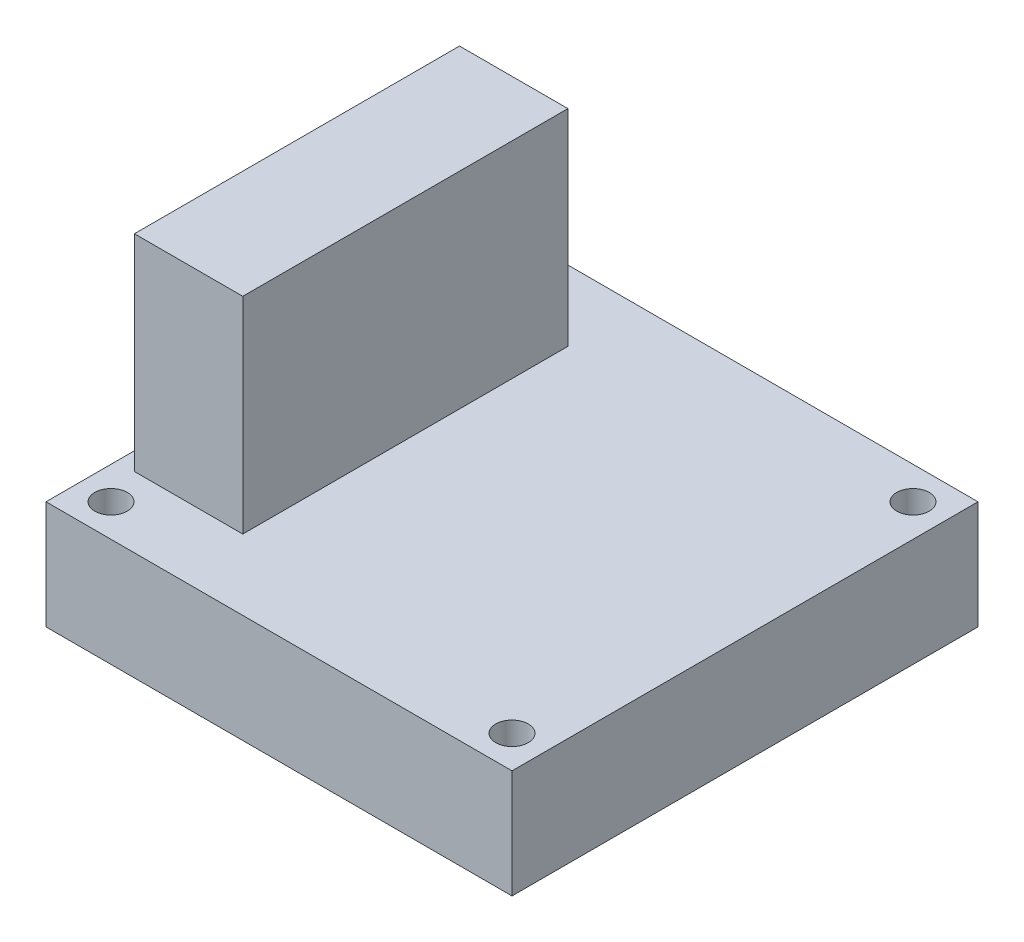
ISO-10303-21;
HEADER;
FILE_DESCRIPTION(('STEP AP214'),'2;1');
FILE_NAME('part.step','',(''),(''),'','','');
FILE_SCHEMA(('AUTOMOTIVE_DESIGN { 1 0 10303 214 1 1 1 1 }'));
ENDSEC;
DATA;
#1=APPLICATION_CONTEXT('core data for automotive mechanical design processes');
#2=APPLICATION_PROTOCOL_DEFINITION('international standard','automotive_design',2000,#1);
#3=PRODUCT_CONTEXT('',#1,'mechanical');
#4=PRODUCT('Part','Part','',(#3));
#5=PRODUCT_RELATED_PRODUCT_CATEGORY('part','',(#4));
#6=PRODUCT_DEFINITION_FORMATION('','',#4);
#7=PRODUCT_DEFINITION_CONTEXT('part definition',#1,'design');
#8=PRODUCT_DEFINITION('design','',#6,#7);
#9=PRODUCT_DEFINITION_SHAPE('','',#8);
#10=(LENGTH_UNIT() NAMED_UNIT(*) SI_UNIT(.MILLI.,.METRE.));
#11=(NAMED_UNIT(*) PLANE_ANGLE_UNIT() SI_UNIT($,.RADIAN.));
#12=(NAMED_UNIT(*) SI_UNIT($,.STERADIAN.) SOLID_ANGLE_UNIT());
#13=UNCERTAINTY_MEASURE_WITH_UNIT(LENGTH_MEASURE(1.E-05),#10,'distance_accuracy_value','');
#14=(GEOMETRIC_REPRESENTATION_CONTEXT(3) GLOBAL_UNCERTAINTY_ASSIGNED_CONTEXT((#13)) GLOBAL_UNIT_ASSIGNED_CONTEXT((#10,
#11,#12)) REPRESENTATION_CONTEXT('',''));
#15=CARTESIAN_POINT('',(0.,0.,0.));
#16=DIRECTION('',(0.,0.,1.));
#17=DIRECTION('',(1.,0.,0.));
#18=AXIS2_PLACEMENT_3D('',#15,#16,#17);
#19=CARTESIAN_POINT('',(0.,10.,0.));
#20=DIRECTION('',(0.,-1.,0.));
#21=DIRECTION('',(0.,0.,-1.));
#22=AXIS2_PLACEMENT_3D('',#19,#20,#21);
#23=PLANE('',#22);
#24=CARTESIAN_POINT('',(-18.499999999999,10.,18.5));
#25=DIRECTION('',(0.,1.,0.));
#26=DIRECTION('',(0.,0.,1.));
#27=AXIS2_PLACEMENT_3D('',#24,#25,#26);
#28=CIRCLE('',#27,1.50000000000055);
#29=CARTESIAN_POINT('',(-18.499999999999,10.,20.0000000000006));
#30=VERTEX_POINT('',#29);
#31=EDGE_CURVE('E126',#30,#30,#28,.T.);
#32=ORIENTED_EDGE('',*,*,#31,.F.);
#33=EDGE_LOOP('',(#32));
#34=FACE_BOUND('',#33,.T.);
#35=CARTESIAN_POINT('',(18.500000000001,10.,18.499999999999));
#36=DIRECTION('',(0.,1.,0.));
#37=DIRECTION('',(0.,0.,1.));
#38=AXIS2_PLACEMENT_3D('',#35,#36,#37);
#39=CIRCLE('',#38,1.50000000000147);
#40=CARTESIAN_POINT('',(18.500000000001,10.,20.0000000000004));
#41=VERTEX_POINT('',#40);
#42=EDGE_CURVE('E135',#41,#41,#39,.T.);
#43=ORIENTED_EDGE('',*,*,#42,.F.);
#44=EDGE_LOOP('',(#43));
#45=FACE_BOUND('',#44,.T.);
#46=CARTESIAN_POINT('',(18.5,10.,-18.500000000001));
#47=DIRECTION('',(0.,1.,0.));
#48=DIRECTION('',(0.,0.,1.));
#49=AXIS2_PLACEMENT_3D('',#46,#47,#48);
#50=CIRCLE('',#49,1.50000000000108);
#51=CARTESIAN_POINT('',(18.5,10.,-17.));
#52=VERTEX_POINT('',#51);
#53=EDGE_CURVE('E141',#52,#52,#50,.T.);
#54=ORIENTED_EDGE('',*,*,#53,.F.);
#55=EDGE_LOOP('',(#54));
#56=FACE_BOUND('',#55,.T.);
#57=CARTESIAN_POINT('',(-18.5,10.,-18.5));
#58=DIRECTION('',(0.,1.,0.));
#59=DIRECTION('',(0.,0.,1.));
#60=AXIS2_PLACEMENT_3D('',#57,#58,#59);
#61=CIRCLE('',#60,1.5);
#62=CARTESIAN_POINT('',(-18.5,10.,-17.));
#63=VERTEX_POINT('',#62);
#64=EDGE_CURVE('E147',#63,#63,#61,.T.);
#65=ORIENTED_EDGE('',*,*,#64,.F.);
#66=EDGE_LOOP('',(#65));
#67=FACE_BOUND('',#66,.T.);
#68=DIRECTION('',(0.,0.,-1.));
#69=VECTOR('',#68,1.);
#70=CARTESIAN_POINT('',(21.5,10.,21.5));
#71=LINE('',#70,#69);
#72=CARTESIAN_POINT('',(21.5,10.,21.5));
#73=VERTEX_POINT('',#72);
#74=CARTESIAN_POINT('',(21.5,10.,-21.5));
#75=VERTEX_POINT('',#74);
#76=EDGE_CURVE('E153',#73,#75,#71,.T.);
#77=ORIENTED_EDGE('',*,*,#76,.T.);
#78=DIRECTION('',(-1.,0.,0.));
#79=VECTOR('',#78,1.);
#80=CARTESIAN_POINT('',(-21.5,10.,-21.5));
#81=LINE('',#80,#79);
#82=CARTESIAN_POINT('',(-21.5,10.,-21.5));
#83=VERTEX_POINT('',#82);
#84=EDGE_CURVE('E156',#75,#83,#81,.T.);
#85=ORIENTED_EDGE('',*,*,#84,.T.);
#86=DIRECTION('',(0.,0.,1.));
#87=VECTOR('',#86,1.);
#88=CARTESIAN_POINT('',(-21.5,10.,21.5));
#89=LINE('',#88,#87);
#90=CARTESIAN_POINT('',(-21.5,10.,21.5));
#91=VERTEX_POINT('',#90);
#92=EDGE_CURVE('E159',#83,#91,#89,.T.);
#93=ORIENTED_EDGE('',*,*,#92,.T.);
#94=DIRECTION('',(1.,0.,0.));
#95=VECTOR('',#94,1.);
#96=CARTESIAN_POINT('',(-21.5,10.,21.5));
#97=LINE('',#96,#95);
#98=EDGE_CURVE('E161',#91,#73,#97,.T.);
#99=ORIENTED_EDGE('',*,*,#98,.T.);
#100=EDGE_LOOP('',(#77,#85,#93,#99));
#101=FACE_BOUND('',#100,.T.);
#102=DIRECTION('',(0.,0.,1.));
#103=VECTOR('',#102,1.);
#104=CARTESIAN_POINT('',(-19.8419424005025,10.,15.));
#105=LINE('',#104,#103);
#106=CARTESIAN_POINT('',(-19.8419424005025,10.,-15.));
#107=VERTEX_POINT('',#106);
#108=CARTESIAN_POINT('',(-19.8419424005025,10.,15.));
#109=VERTEX_POINT('',#108);
#110=EDGE_CURVE('E122',#107,#109,#105,.T.);
#111=ORIENTED_EDGE('',*,*,#110,.F.);
#112=DIRECTION('',(-1.,0.,0.));
#113=VECTOR('',#112,1.);
#114=CARTESIAN_POINT('',(-9.84194240050252,10.,-15.));
#115=LINE('',#114,#113);
#116=CARTESIAN_POINT('',(-9.84194240050252,10.,-15.));
#117=VERTEX_POINT('',#116);
#118=EDGE_CURVE('E119',#117,#107,#115,.T.);
#119=ORIENTED_EDGE('',*,*,#118,.F.);
#120=DIRECTION('',(0.,0.,-1.));
#121=VECTOR('',#120,1.);
#122=CARTESIAN_POINT('',(-9.84194240050252,10.,15.));
#123=LINE('',#122,#121);
#124=CARTESIAN_POINT('',(-9.84194240050252,10.,15.));
#125=VERTEX_POINT('',#124);
#126=EDGE_CURVE('E57',#125,#117,#123,.T.);
#127=ORIENTED_EDGE('',*,*,#126,.F.);
#128=DIRECTION('',(1.,0.,0.));
#129=VECTOR('',#128,1.);
#130=CARTESIAN_POINT('',(-9.84194240050252,10.,15.));
#131=LINE('',#130,#129);
#132=EDGE_CURVE('E52',#109,#125,#131,.T.);
#133=ORIENTED_EDGE('',*,*,#132,.F.);
#134=EDGE_LOOP('',(#111,#119,#127,#133));
#135=FACE_BOUND('',#134,.T.);
#136=ADVANCED_FACE('F37',(#34,#45,#56,#67,#101,#135),#23,.F.);
#137=CARTESIAN_POINT('',(0.,0.,0.));
#138=DIRECTION('',(0.,-1.,0.));
#139=DIRECTION('',(0.,0.,-1.));
#140=AXIS2_PLACEMENT_3D('',#137,#138,#139);
#141=PLANE('',#140);
#142=CARTESIAN_POINT('',(18.500000000001,0.,18.499999999999));
#143=DIRECTION('',(0.,1.,0.));
#144=DIRECTION('',(0.,0.,1.));
#145=AXIS2_PLACEMENT_3D('',#142,#143,#144);
#146=CIRCLE('',#145,1.50000000000147);
#147=CARTESIAN_POINT('',(18.500000000001,0.,20.0000000000004));
#148=VERTEX_POINT('',#147);
#149=EDGE_CURVE('E133',#148,#148,#146,.T.);
#150=ORIENTED_EDGE('',*,*,#149,.T.);
#151=EDGE_LOOP('',(#150));
#152=FACE_BOUND('',#151,.T.);
#153=CARTESIAN_POINT('',(-18.5,0.,-18.5));
#154=DIRECTION('',(0.,1.,0.));
#155=DIRECTION('',(0.,0.,1.));
#156=AXIS2_PLACEMENT_3D('',#153,#154,#155);
#157=CIRCLE('',#156,1.5);
#158=CARTESIAN_POINT('',(-18.5,0.,-17.));
#159=VERTEX_POINT('',#158);
#160=EDGE_CURVE('E144',#159,#159,#157,.T.);
#161=ORIENTED_EDGE('',*,*,#160,.T.);
#162=EDGE_LOOP('',(#161));
#163=FACE_BOUND('',#162,.T.);
#164=DIRECTION('',(0.,0.,-1.));
#165=VECTOR('',#164,1.);
#166=CARTESIAN_POINT('',(21.5,0.,21.5));
#167=LINE('',#166,#165);
#168=CARTESIAN_POINT('',(21.5,0.,21.5));
#169=VERTEX_POINT('',#168);
#170=CARTESIAN_POINT('',(21.5,0.,-21.5));
#171=VERTEX_POINT('',#170);
#172=EDGE_CURVE('E150',#169,#171,#167,.T.);
#173=ORIENTED_EDGE('',*,*,#172,.F.);
#174=DIRECTION('',(1.,0.,0.));
#175=VECTOR('',#174,1.);
#176=CARTESIAN_POINT('',(-21.5,0.,21.5));
#177=LINE('',#176,#175);
#178=CARTESIAN_POINT('',(-21.5,0.,21.5));
#179=VERTEX_POINT('',#178);
#180=EDGE_CURVE('E157',#179,#169,#177,.T.);
#181=ORIENTED_EDGE('',*,*,#180,.F.);
#182=DIRECTION('',(0.,0.,1.));
#183=VECTOR('',#182,1.);
#184=CARTESIAN_POINT('',(-21.5,0.,21.5));
#185=LINE('',#184,#183);
#186=CARTESIAN_POINT('',(-21.5,0.,-21.5));
#187=VERTEX_POINT('',#186);
#188=EDGE_CURVE('E168',#187,#179,#185,.T.);
#189=ORIENTED_EDGE('',*,*,#188,.F.);
#190=DIRECTION('',(-1.,0.,0.));
#191=VECTOR('',#190,1.);
#192=CARTESIAN_POINT('',(-21.5,0.,-21.5));
#193=LINE('',#192,#191);
#194=EDGE_CURVE('E166',#171,#187,#193,.T.);
#195=ORIENTED_EDGE('',*,*,#194,.F.);
#196=EDGE_LOOP('',(#173,#181,#189,#195));
#197=FACE_BOUND('',#196,.T.);
#198=CARTESIAN_POINT('',(18.5,0.,-18.500000000001));
#199=DIRECTION('',(0.,1.,0.));
#200=DIRECTION('',(0.,0.,1.));
#201=AXIS2_PLACEMENT_3D('',#198,#199,#200);
#202=CIRCLE('',#201,1.50000000000108);
#203=CARTESIAN_POINT('',(18.5,0.,-17.));
#204=VERTEX_POINT('',#203);
#205=EDGE_CURVE('E138',#204,#204,#202,.T.);
#206=ORIENTED_EDGE('',*,*,#205,.T.);
#207=EDGE_LOOP('',(#206));
#208=FACE_BOUND('',#207,.T.);
#209=CARTESIAN_POINT('',(-18.499999999999,0.,18.5));
#210=DIRECTION('',(0.,1.,0.));
#211=DIRECTION('',(0.,0.,1.));
#212=AXIS2_PLACEMENT_3D('',#209,#210,#211);
#213=CIRCLE('',#212,1.50000000000055);
#214=CARTESIAN_POINT('',(-18.499999999999,0.,20.0000000000006));
#215=VERTEX_POINT('',#214);
#216=EDGE_CURVE('E123',#215,#215,#213,.T.);
#217=ORIENTED_EDGE('',*,*,#216,.T.);
#218=EDGE_LOOP('',(#217));
#219=FACE_BOUND('',#218,.T.);
#220=ADVANCED_FACE('F186',(#152,#163,#197,#208,#219),#141,.T.);
#221=CARTESIAN_POINT('',(21.5,10.,21.5));
#222=DIRECTION('',(-1.,0.,0.));
#223=DIRECTION('',(0.,0.,1.));
#224=AXIS2_PLACEMENT_3D('',#221,#222,#223);
#225=PLANE('',#224);
#226=ORIENTED_EDGE('',*,*,#172,.T.);
#227=DIRECTION('',(0.,-1.,0.));
#228=VECTOR('',#227,1.);
#229=CARTESIAN_POINT('',(21.5,10.,-21.5));
#230=LINE('',#229,#228);
#231=EDGE_CURVE('E11',#75,#171,#230,.T.);
#232=ORIENTED_EDGE('',*,*,#231,.F.);
#233=ORIENTED_EDGE('',*,*,#76,.F.);
#234=DIRECTION('',(0.,-1.,0.));
#235=VECTOR('',#234,1.);
#236=CARTESIAN_POINT('',(21.5,10.,21.5));
#237=LINE('',#236,#235);
#238=EDGE_CURVE('E163',#73,#169,#237,.T.);
#239=ORIENTED_EDGE('',*,*,#238,.T.);
#240=EDGE_LOOP('',(#226,#232,#233,#239));
#241=FACE_BOUND('',#240,.T.);
#242=ADVANCED_FACE('F39',(#241),#225,.F.);
#243=CARTESIAN_POINT('',(-21.5,10.,-21.5));
#244=DIRECTION('',(0.,0.,1.));
#245=DIRECTION('',(1.,0.,0.));
#246=AXIS2_PLACEMENT_3D('',#243,#244,#245);
#247=PLANE('',#246);
#248=ORIENTED_EDGE('',*,*,#194,.T.);
#249=DIRECTION('',(0.,-1.,0.));
#250=VECTOR('',#249,1.);
#251=CARTESIAN_POINT('',(-21.5,10.,-21.5));
#252=LINE('',#251,#250);
#253=EDGE_CURVE('E45',#83,#187,#252,.T.);
#254=ORIENTED_EDGE('',*,*,#253,.F.);
#255=ORIENTED_EDGE('',*,*,#84,.F.);
#256=ORIENTED_EDGE('',*,*,#231,.T.);
#257=EDGE_LOOP('',(#248,#254,#255,#256));
#258=FACE_BOUND('',#257,.T.);
#259=ADVANCED_FACE('F196',(#258),#247,.F.);
#260=CARTESIAN_POINT('',(-21.5,10.,21.5));
#261=DIRECTION('',(1.,0.,0.));
#262=DIRECTION('',(0.,0.,-1.));
#263=AXIS2_PLACEMENT_3D('',#260,#261,#262);
#264=PLANE('',#263);
#265=ORIENTED_EDGE('',*,*,#188,.T.);
#266=DIRECTION('',(0.,-1.,0.));
#267=VECTOR('',#266,1.);
#268=CARTESIAN_POINT('',(-21.5,10.,21.5));
#269=LINE('',#268,#267);
#270=EDGE_CURVE('E173',#91,#179,#269,.T.);
#271=ORIENTED_EDGE('',*,*,#270,.F.);
#272=ORIENTED_EDGE('',*,*,#92,.F.);
#273=ORIENTED_EDGE('',*,*,#253,.T.);
#274=EDGE_LOOP('',(#265,#271,#272,#273));
#275=FACE_BOUND('',#274,.T.);
#276=ADVANCED_FACE('F180',(#275),#264,.F.);
#277=CARTESIAN_POINT('',(-21.5,10.,21.5));
#278=DIRECTION('',(0.,0.,-1.));
#279=DIRECTION('',(-1.,0.,0.));
#280=AXIS2_PLACEMENT_3D('',#277,#278,#279);
#281=PLANE('',#280);
#282=ORIENTED_EDGE('',*,*,#180,.T.);
#283=ORIENTED_EDGE('',*,*,#238,.F.);
#284=ORIENTED_EDGE('',*,*,#98,.F.);
#285=ORIENTED_EDGE('',*,*,#270,.T.);
#286=EDGE_LOOP('',(#282,#283,#284,#285));
#287=FACE_BOUND('',#286,.T.);
#288=ADVANCED_FACE('F190',(#287),#281,.F.);
#289=CARTESIAN_POINT('',(-18.5,10.,-18.5));
#290=DIRECTION('',(0.,-1.,0.));
#291=DIRECTION('',(0.,0.,-1.));
#292=AXIS2_PLACEMENT_3D('',#289,#290,#291);
#293=CYLINDRICAL_SURFACE('',#292,1.5);
#294=ORIENTED_EDGE('',*,*,#64,.T.);
#295=EDGE_LOOP('',(#294));
#296=FACE_BOUND('',#295,.T.);
#297=ORIENTED_EDGE('',*,*,#160,.F.);
#298=EDGE_LOOP('',(#297));
#299=FACE_BOUND('',#298,.T.);
#300=ADVANCED_FACE('F214',(#296,#299),#293,.F.);
#301=CARTESIAN_POINT('',(18.5,10.,-18.500000000001));
#302=DIRECTION('',(0.,-1.,0.));
#303=DIRECTION('',(0.,0.,-1.));
#304=AXIS2_PLACEMENT_3D('',#301,#302,#303);
#305=CYLINDRICAL_SURFACE('',#304,1.50000000000108);
#306=ORIENTED_EDGE('',*,*,#53,.T.);
#307=EDGE_LOOP('',(#306));
#308=FACE_BOUND('',#307,.T.);
#309=ORIENTED_EDGE('',*,*,#205,.F.);
#310=EDGE_LOOP('',(#309));
#311=FACE_BOUND('',#310,.T.);
#312=ADVANCED_FACE('F221',(#308,#311),#305,.F.);
#313=CARTESIAN_POINT('',(18.500000000001,10.,18.499999999999));
#314=DIRECTION('',(0.,-1.,0.));
#315=DIRECTION('',(0.,0.,-1.));
#316=AXIS2_PLACEMENT_3D('',#313,#314,#315);
#317=CYLINDRICAL_SURFACE('',#316,1.50000000000147);
#318=ORIENTED_EDGE('',*,*,#42,.T.);
#319=EDGE_LOOP('',(#318));
#320=FACE_BOUND('',#319,.T.);
#321=ORIENTED_EDGE('',*,*,#149,.F.);
#322=EDGE_LOOP('',(#321));
#323=FACE_BOUND('',#322,.T.);
#324=ADVANCED_FACE('F226',(#320,#323),#317,.F.);
#325=CARTESIAN_POINT('',(-18.499999999999,10.,18.5));
#326=DIRECTION('',(0.,-1.,0.));
#327=DIRECTION('',(0.,0.,-1.));
#328=AXIS2_PLACEMENT_3D('',#325,#326,#327);
#329=CYLINDRICAL_SURFACE('',#328,1.50000000000055);
#330=ORIENTED_EDGE('',*,*,#31,.T.);
#331=EDGE_LOOP('',(#330));
#332=FACE_BOUND('',#331,.T.);
#333=ORIENTED_EDGE('',*,*,#216,.F.);
#334=EDGE_LOOP('',(#333));
#335=FACE_BOUND('',#334,.T.);
#336=ADVANCED_FACE('F236',(#332,#335),#329,.F.);
#337=CARTESIAN_POINT('',(-19.8419424005025,29.,15.));
#338=DIRECTION('',(1.,0.,0.));
#339=DIRECTION('',(0.,0.,-1.));
#340=AXIS2_PLACEMENT_3D('',#337,#338,#339);
#341=PLANE('',#340);
#342=ORIENTED_EDGE('',*,*,#110,.T.);
#343=DIRECTION('',(0.,-1.,0.));
#344=VECTOR('',#343,1.);
#345=CARTESIAN_POINT('',(-19.8419424005025,29.,15.));
#346=LINE('',#345,#344);
#347=CARTESIAN_POINT('',(-19.8419424005025,29.,15.));
#348=VERTEX_POINT('',#347);
#349=EDGE_CURVE('E103',#348,#109,#346,.T.);
#350=ORIENTED_EDGE('',*,*,#349,.F.);
#351=DIRECTION('',(0.,0.,1.));
#352=VECTOR('',#351,1.);
#353=CARTESIAN_POINT('',(-19.8419424005025,29.,15.));
#354=LINE('',#353,#352);
#355=CARTESIAN_POINT('',(-19.8419424005025,29.,-15.));
#356=VERTEX_POINT('',#355);
#357=EDGE_CURVE('E110',#356,#348,#354,.T.);
#358=ORIENTED_EDGE('',*,*,#357,.F.);
#359=DIRECTION('',(0.,-1.,0.));
#360=VECTOR('',#359,1.);
#361=CARTESIAN_POINT('',(-19.8419424005025,29.,-15.));
#362=LINE('',#361,#360);
#363=EDGE_CURVE('E369',#356,#107,#362,.T.);
#364=ORIENTED_EDGE('',*,*,#363,.T.);
#365=EDGE_LOOP('',(#342,#350,#358,#364));
#366=FACE_BOUND('',#365,.T.);
#367=ADVANCED_FACE('F121',(#366),#341,.F.);
#368=CARTESIAN_POINT('',(-9.84194240050252,29.,15.));
#369=DIRECTION('',(0.,0.,-1.));
#370=DIRECTION('',(-1.,0.,0.));
#371=AXIS2_PLACEMENT_3D('',#368,#369,#370);
#372=PLANE('',#371);
#373=ORIENTED_EDGE('',*,*,#132,.T.);
#374=DIRECTION('',(0.,-1.,0.));
#375=VECTOR('',#374,1.);
#376=CARTESIAN_POINT('',(-9.84194240050252,29.,15.));
#377=LINE('',#376,#375);
#378=CARTESIAN_POINT('',(-9.84194240050252,29.,15.));
#379=VERTEX_POINT('',#378);
#380=EDGE_CURVE('E106',#379,#125,#377,.T.);
#381=ORIENTED_EDGE('',*,*,#380,.F.);
#382=DIRECTION('',(1.,0.,0.));
#383=VECTOR('',#382,1.);
#384=CARTESIAN_POINT('',(-9.84194240050252,29.,15.));
#385=LINE('',#384,#383);
#386=EDGE_CURVE('E99',#348,#379,#385,.T.);
#387=ORIENTED_EDGE('',*,*,#386,.F.);
#388=ORIENTED_EDGE('',*,*,#349,.T.);
#389=EDGE_LOOP('',(#373,#381,#387,#388));
#390=FACE_BOUND('',#389,.T.);
#391=ADVANCED_FACE('F101',(#390),#372,.F.);
#392=CARTESIAN_POINT('',(-9.84194240050252,29.,15.));
#393=DIRECTION('',(-1.,0.,0.));
#394=DIRECTION('',(0.,0.,1.));
#395=AXIS2_PLACEMENT_3D('',#392,#393,#394);
#396=PLANE('',#395);
#397=ORIENTED_EDGE('',*,*,#126,.T.);
#398=DIRECTION('',(0.,-1.,0.));
#399=VECTOR('',#398,1.);
#400=CARTESIAN_POINT('',(-9.84194240050252,29.,-15.));
#401=LINE('',#400,#399);
#402=CARTESIAN_POINT('',(-9.84194240050252,29.,-15.));
#403=VERTEX_POINT('',#402);
#404=EDGE_CURVE('E128',#403,#117,#401,.T.);
#405=ORIENTED_EDGE('',*,*,#404,.F.);
#406=DIRECTION('',(0.,0.,-1.));
#407=VECTOR('',#406,1.);
#408=CARTESIAN_POINT('',(-9.84194240050252,29.,15.));
#409=LINE('',#408,#407);
#410=EDGE_CURVE('E109',#379,#403,#409,.T.);
#411=ORIENTED_EDGE('',*,*,#410,.F.);
#412=ORIENTED_EDGE('',*,*,#380,.T.);
#413=EDGE_LOOP('',(#397,#405,#411,#412));
#414=FACE_BOUND('',#413,.T.);
#415=ADVANCED_FACE('F248',(#414),#396,.F.);
#416=CARTESIAN_POINT('',(-9.84194240050252,29.,-15.));
#417=DIRECTION('',(0.,0.,1.));
#418=DIRECTION('',(1.,0.,0.));
#419=AXIS2_PLACEMENT_3D('',#416,#417,#418);
#420=PLANE('',#419);
#421=ORIENTED_EDGE('',*,*,#118,.T.);
#422=ORIENTED_EDGE('',*,*,#363,.F.);
#423=DIRECTION('',(-1.,0.,0.));
#424=VECTOR('',#423,1.);
#425=CARTESIAN_POINT('',(-9.84194240050252,29.,-15.));
#426=LINE('',#425,#424);
#427=EDGE_CURVE('E115',#403,#356,#426,.T.);
#428=ORIENTED_EDGE('',*,*,#427,.F.);
#429=ORIENTED_EDGE('',*,*,#404,.T.);
#430=EDGE_LOOP('',(#421,#422,#428,#429));
#431=FACE_BOUND('',#430,.T.);
#432=ADVANCED_FACE('F251',(#431),#420,.F.);
#433=CARTESIAN_POINT('',(0.,29.,0.));
#434=DIRECTION('',(0.,1.,0.));
#435=DIRECTION('',(0.,0.,1.));
#436=AXIS2_PLACEMENT_3D('',#433,#434,#435);
#437=PLANE('',#436);
#438=ORIENTED_EDGE('',*,*,#357,.T.);
#439=ORIENTED_EDGE('',*,*,#386,.T.);
#440=ORIENTED_EDGE('',*,*,#410,.T.);
#441=ORIENTED_EDGE('',*,*,#427,.T.);
#442=EDGE_LOOP('',(#438,#439,#440,#441));
#443=FACE_BOUND('',#442,.T.);
#444=ADVANCED_FACE('F113',(#443),#437,.T.);
#445=CLOSED_SHELL('',(#136,#220,#242,#259,#276,#288,#300,#312,#324,#336,#367,#391,#415,#432,#444));
#446=MANIFOLD_SOLID_BREP('B2',#445);
#447=ADVANCED_BREP_SHAPE_REPRESENTATION('',(#18,#446),#14);
#448=SHAPE_DEFINITION_REPRESENTATION(#9,#447);
ENDSEC;
END-ISO-10303-21;
